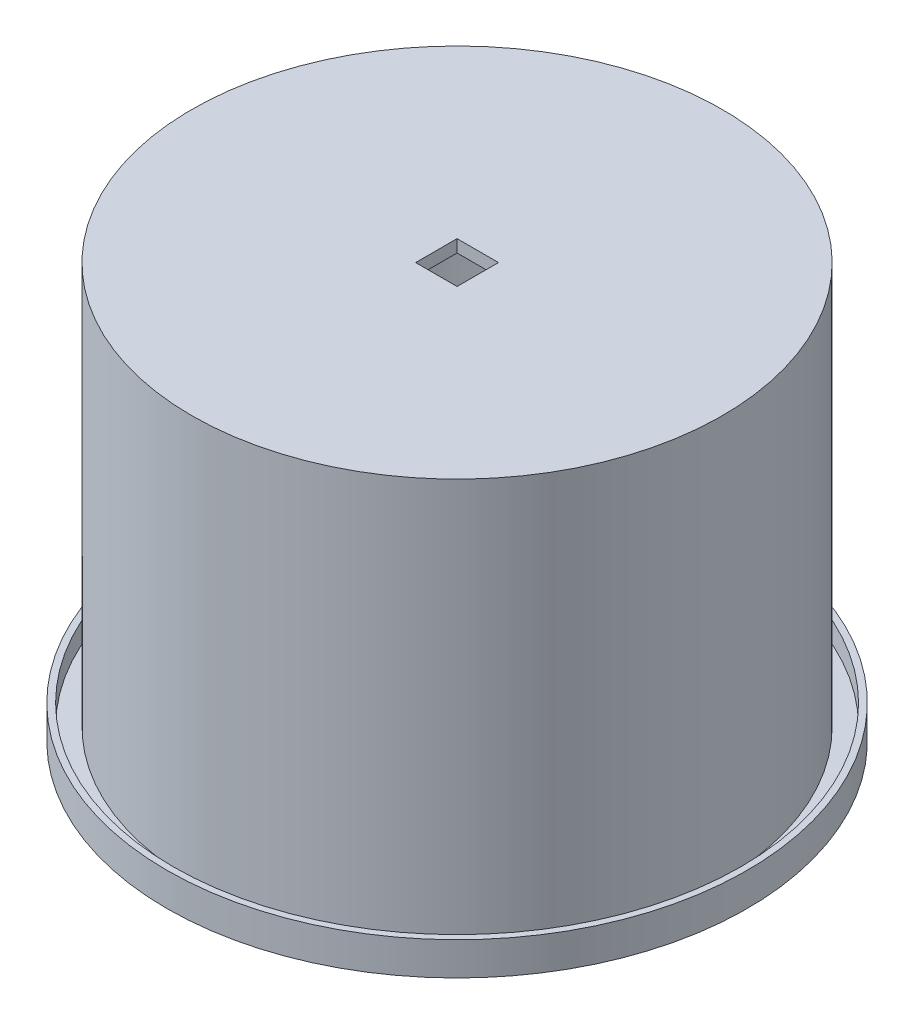
ISO-10303-21;
HEADER;
FILE_DESCRIPTION(('STEP AP214'),'2;1');
FILE_NAME('part.step','',(''),(''),'','','');
FILE_SCHEMA(('AUTOMOTIVE_DESIGN { 1 0 10303 214 1 1 1 1 }'));
ENDSEC;
DATA;
#1=APPLICATION_CONTEXT('core data for automotive mechanical design processes');
#2=APPLICATION_PROTOCOL_DEFINITION('international standard','automotive_design',2000,#1);
#3=PRODUCT_CONTEXT('',#1,'mechanical');
#4=PRODUCT('Part','Part','',(#3));
#5=PRODUCT_RELATED_PRODUCT_CATEGORY('part','',(#4));
#6=PRODUCT_DEFINITION_FORMATION('','',#4);
#7=PRODUCT_DEFINITION_CONTEXT('part definition',#1,'design');
#8=PRODUCT_DEFINITION('design','',#6,#7);
#9=PRODUCT_DEFINITION_SHAPE('','',#8);
#10=(LENGTH_UNIT() NAMED_UNIT(*) SI_UNIT(.MILLI.,.METRE.));
#11=(NAMED_UNIT(*) PLANE_ANGLE_UNIT() SI_UNIT($,.RADIAN.));
#12=(NAMED_UNIT(*) SI_UNIT($,.STERADIAN.) SOLID_ANGLE_UNIT());
#13=UNCERTAINTY_MEASURE_WITH_UNIT(LENGTH_MEASURE(1.E-05),#10,'distance_accuracy_value','');
#14=(GEOMETRIC_REPRESENTATION_CONTEXT(3) GLOBAL_UNCERTAINTY_ASSIGNED_CONTEXT((#13)) GLOBAL_UNIT_ASSIGNED_CONTEXT((#10,
#11,#12)) REPRESENTATION_CONTEXT('',''));
#15=CARTESIAN_POINT('',(0.,0.,0.));
#16=DIRECTION('',(0.,0.,1.));
#17=DIRECTION('',(1.,0.,0.));
#18=AXIS2_PLACEMENT_3D('',#15,#16,#17);
#19=CARTESIAN_POINT('',(0.,100.,0.));
#20=DIRECTION('',(0.,-1.,0.));
#21=DIRECTION('',(0.,0.,-1.));
#22=AXIS2_PLACEMENT_3D('',#19,#20,#21);
#23=CYLINDRICAL_SURFACE('',#22,62.5);
#24=CARTESIAN_POINT('',(0.,0.,0.));
#25=DIRECTION('',(0.,1.,0.));
#26=DIRECTION('',(0.,0.,1.));
#27=AXIS2_PLACEMENT_3D('',#24,#25,#26);
#28=CIRCLE('',#27,62.5);
#29=CARTESIAN_POINT('',(0.,0.,62.5));
#30=VERTEX_POINT('',#29);
#31=EDGE_CURVE('E104',#30,#30,#28,.T.);
#32=ORIENTED_EDGE('',*,*,#31,.F.);
#33=EDGE_LOOP('',(#32));
#34=FACE_BOUND('',#33,.T.);
#35=CARTESIAN_POINT('',(0.,97.,0.));
#36=DIRECTION('',(0.,1.,0.));
#37=DIRECTION('',(0.,0.,1.));
#38=AXIS2_PLACEMENT_3D('',#35,#36,#37);
#39=CIRCLE('',#38,62.5);
#40=CARTESIAN_POINT('',(0.,97.,62.5));
#41=VERTEX_POINT('',#40);
#42=EDGE_CURVE('E99',#41,#41,#39,.T.);
#43=ORIENTED_EDGE('',*,*,#42,.T.);
#44=EDGE_LOOP('',(#43));
#45=FACE_BOUND('',#44,.T.);
#46=ADVANCED_FACE('F32',(#34,#45),#23,.F.);
#47=CARTESIAN_POINT('',(0.,8.,0.));
#48=DIRECTION('',(0.,1.,0.));
#49=DIRECTION('',(0.,0.,1.));
#50=AXIS2_PLACEMENT_3D('',#47,#48,#49);
#51=PLANE('',#50);
#52=CARTESIAN_POINT('',(0.,8.,0.));
#53=DIRECTION('',(0.,1.,0.));
#54=DIRECTION('',(0.,0.,1.));
#55=AXIS2_PLACEMENT_3D('',#52,#53,#54);
#56=CIRCLE('',#55,70.);
#57=CARTESIAN_POINT('',(0.,8.,70.));
#58=VERTEX_POINT('',#57);
#59=EDGE_CURVE('E117',#58,#58,#56,.T.);
#60=ORIENTED_EDGE('',*,*,#59,.T.);
#61=EDGE_LOOP('',(#60));
#62=FACE_BOUND('',#61,.T.);
#63=CARTESIAN_POINT('',(0.,8.,0.));
#64=DIRECTION('',(0.,1.,0.));
#65=DIRECTION('',(0.,0.,1.));
#66=AXIS2_PLACEMENT_3D('',#63,#64,#65);
#67=CIRCLE('',#66,68.5);
#68=CARTESIAN_POINT('',(0.,8.,68.5));
#69=VERTEX_POINT('',#68);
#70=EDGE_CURVE('E113',#69,#69,#67,.T.);
#71=ORIENTED_EDGE('',*,*,#70,.F.);
#72=EDGE_LOOP('',(#71));
#73=FACE_BOUND('',#72,.T.);
#74=ADVANCED_FACE('F146',(#62,#73),#51,.T.);
#75=CARTESIAN_POINT('',(0.,0.,0.));
#76=DIRECTION('',(0.,1.,0.));
#77=DIRECTION('',(0.,0.,1.));
#78=AXIS2_PLACEMENT_3D('',#75,#76,#77);
#79=PLANE('',#78);
#80=CARTESIAN_POINT('',(0.,0.,0.));
#81=DIRECTION('',(0.,1.,0.));
#82=DIRECTION('',(0.,0.,1.));
#83=AXIS2_PLACEMENT_3D('',#80,#81,#82);
#84=CIRCLE('',#83,70.);
#85=CARTESIAN_POINT('',(0.,0.,70.));
#86=VERTEX_POINT('',#85);
#87=EDGE_CURVE('E116',#86,#86,#84,.T.);
#88=ORIENTED_EDGE('',*,*,#87,.F.);
#89=EDGE_LOOP('',(#88));
#90=FACE_BOUND('',#89,.T.);
#91=ORIENTED_EDGE('',*,*,#31,.T.);
#92=EDGE_LOOP('',(#91));
#93=FACE_BOUND('',#92,.T.);
#94=ADVANCED_FACE('F152',(#90,#93),#79,.F.);
#95=CARTESIAN_POINT('',(0.,8.,0.));
#96=DIRECTION('',(0.,-1.,0.));
#97=DIRECTION('',(0.,0.,-1.));
#98=AXIS2_PLACEMENT_3D('',#95,#96,#97);
#99=CYLINDRICAL_SURFACE('',#98,70.);
#100=ORIENTED_EDGE('',*,*,#59,.F.);
#101=EDGE_LOOP('',(#100));
#102=FACE_BOUND('',#101,.T.);
#103=ORIENTED_EDGE('',*,*,#87,.T.);
#104=EDGE_LOOP('',(#103));
#105=FACE_BOUND('',#104,.T.);
#106=ADVANCED_FACE('F34',(#102,#105),#99,.T.);
#107=CARTESIAN_POINT('',(0.,8.,0.));
#108=DIRECTION('',(0.,-1.,0.));
#109=DIRECTION('',(0.,0.,-1.));
#110=AXIS2_PLACEMENT_3D('',#107,#108,#109);
#111=CYLINDRICAL_SURFACE('',#110,68.5);
#112=CARTESIAN_POINT('',(0.,3.,0.));
#113=DIRECTION('',(0.,1.,0.));
#114=DIRECTION('',(0.,0.,1.));
#115=AXIS2_PLACEMENT_3D('',#112,#113,#114);
#116=CIRCLE('',#115,68.5);
#117=CARTESIAN_POINT('',(0.,3.,68.5));
#118=VERTEX_POINT('',#117);
#119=EDGE_CURVE('E120',#118,#118,#116,.T.);
#120=ORIENTED_EDGE('',*,*,#119,.F.);
#121=EDGE_LOOP('',(#120));
#122=FACE_BOUND('',#121,.T.);
#123=ORIENTED_EDGE('',*,*,#70,.T.);
#124=EDGE_LOOP('',(#123));
#125=FACE_BOUND('',#124,.T.);
#126=ADVANCED_FACE('F166',(#122,#125),#111,.F.);
#127=CARTESIAN_POINT('',(0.,3.,0.));
#128=DIRECTION('',(0.,1.,0.));
#129=DIRECTION('',(0.,0.,1.));
#130=AXIS2_PLACEMENT_3D('',#127,#128,#129);
#131=PLANE('',#130);
#132=ORIENTED_EDGE('',*,*,#119,.T.);
#133=EDGE_LOOP('',(#132));
#134=FACE_BOUND('',#133,.T.);
#135=CARTESIAN_POINT('',(0.,3.,0.));
#136=DIRECTION('',(0.,1.,0.));
#137=DIRECTION('',(0.,0.,1.));
#138=AXIS2_PLACEMENT_3D('',#135,#136,#137);
#139=CIRCLE('',#138,64.);
#140=CARTESIAN_POINT('',(0.,3.,64.));
#141=VERTEX_POINT('',#140);
#142=EDGE_CURVE('E110',#141,#141,#139,.T.);
#143=ORIENTED_EDGE('',*,*,#142,.F.);
#144=EDGE_LOOP('',(#143));
#145=FACE_BOUND('',#144,.T.);
#146=ADVANCED_FACE('F160',(#134,#145),#131,.T.);
#147=CARTESIAN_POINT('',(0.,100.,0.));
#148=DIRECTION('',(0.,1.,0.));
#149=DIRECTION('',(0.,0.,1.));
#150=AXIS2_PLACEMENT_3D('',#147,#148,#149);
#151=PLANE('',#150);
#152=DIRECTION('',(0.,0.,-1.));
#153=VECTOR('',#152,1.);
#154=CARTESIAN_POINT('',(5.,100.,5.));
#155=LINE('',#154,#153);
#156=CARTESIAN_POINT('',(5.,100.,5.));
#157=VERTEX_POINT('',#156);
#158=CARTESIAN_POINT('',(5.,100.,-5.));
#159=VERTEX_POINT('',#158);
#160=EDGE_CURVE('E47',#157,#159,#155,.T.);
#161=ORIENTED_EDGE('',*,*,#160,.F.);
#162=DIRECTION('',(1.,0.,0.));
#163=VECTOR('',#162,1.);
#164=CARTESIAN_POINT('',(-5.,100.,5.));
#165=LINE('',#164,#163);
#166=CARTESIAN_POINT('',(-5.,100.,5.));
#167=VERTEX_POINT('',#166);
#168=EDGE_CURVE('E92',#167,#157,#165,.T.);
#169=ORIENTED_EDGE('',*,*,#168,.F.);
#170=DIRECTION('',(0.,0.,1.));
#171=VECTOR('',#170,1.);
#172=CARTESIAN_POINT('',(-5.,100.,5.));
#173=LINE('',#172,#171);
#174=CARTESIAN_POINT('',(-5.,100.,-5.));
#175=VERTEX_POINT('',#174);
#176=EDGE_CURVE('E76',#175,#167,#173,.T.);
#177=ORIENTED_EDGE('',*,*,#176,.F.);
#178=DIRECTION('',(-1.,0.,0.));
#179=VECTOR('',#178,1.);
#180=CARTESIAN_POINT('',(-5.,100.,-5.));
#181=LINE('',#180,#179);
#182=EDGE_CURVE('E85',#159,#175,#181,.T.);
#183=ORIENTED_EDGE('',*,*,#182,.F.);
#184=EDGE_LOOP('',(#161,#169,#177,#183));
#185=FACE_BOUND('',#184,.T.);
#186=CARTESIAN_POINT('',(0.,100.,0.));
#187=DIRECTION('',(0.,1.,0.));
#188=DIRECTION('',(0.,0.,1.));
#189=AXIS2_PLACEMENT_3D('',#186,#187,#188);
#190=CIRCLE('',#189,64.);
#191=CARTESIAN_POINT('',(0.,100.,64.));
#192=VERTEX_POINT('',#191);
#193=EDGE_CURVE('E107',#192,#192,#190,.T.);
#194=ORIENTED_EDGE('',*,*,#193,.T.);
#195=EDGE_LOOP('',(#194));
#196=FACE_BOUND('',#195,.T.);
#197=ADVANCED_FACE('F89',(#185,#196),#151,.T.);
#198=CARTESIAN_POINT('',(0.,100.,0.));
#199=DIRECTION('',(0.,-1.,0.));
#200=DIRECTION('',(0.,0.,-1.));
#201=AXIS2_PLACEMENT_3D('',#198,#199,#200);
#202=CYLINDRICAL_SURFACE('',#201,64.);
#203=ORIENTED_EDGE('',*,*,#142,.T.);
#204=EDGE_LOOP('',(#203));
#205=FACE_BOUND('',#204,.T.);
#206=ORIENTED_EDGE('',*,*,#193,.F.);
#207=EDGE_LOOP('',(#206));
#208=FACE_BOUND('',#207,.T.);
#209=ADVANCED_FACE('F142',(#205,#208),#202,.T.);
#210=CARTESIAN_POINT('',(0.,97.,0.));
#211=DIRECTION('',(0.,1.,0.));
#212=DIRECTION('',(0.,0.,1.));
#213=AXIS2_PLACEMENT_3D('',#210,#211,#212);
#214=PLANE('',#213);
#215=DIRECTION('',(1.,0.,0.));
#216=VECTOR('',#215,1.);
#217=CARTESIAN_POINT('',(0.,97.,5.));
#218=LINE('',#217,#216);
#219=CARTESIAN_POINT('',(-5.,97.,5.));
#220=VERTEX_POINT('',#219);
#221=CARTESIAN_POINT('',(5.,97.,5.));
#222=VERTEX_POINT('',#221);
#223=EDGE_CURVE('E40',#220,#222,#218,.T.);
#224=ORIENTED_EDGE('',*,*,#223,.T.);
#225=DIRECTION('',(0.,0.,-1.));
#226=VECTOR('',#225,1.);
#227=CARTESIAN_POINT('',(5.,97.,0.));
#228=LINE('',#227,#226);
#229=CARTESIAN_POINT('',(5.,97.,-5.));
#230=VERTEX_POINT('',#229);
#231=EDGE_CURVE('E11',#222,#230,#228,.T.);
#232=ORIENTED_EDGE('',*,*,#231,.T.);
#233=DIRECTION('',(-1.,0.,0.));
#234=VECTOR('',#233,1.);
#235=CARTESIAN_POINT('',(0.,97.,-5.));
#236=LINE('',#235,#234);
#237=CARTESIAN_POINT('',(-5.,97.,-5.));
#238=VERTEX_POINT('',#237);
#239=EDGE_CURVE('E125',#230,#238,#236,.T.);
#240=ORIENTED_EDGE('',*,*,#239,.T.);
#241=DIRECTION('',(0.,0.,1.));
#242=VECTOR('',#241,1.);
#243=CARTESIAN_POINT('',(-5.,97.,0.));
#244=LINE('',#243,#242);
#245=EDGE_CURVE('E79',#238,#220,#244,.T.);
#246=ORIENTED_EDGE('',*,*,#245,.T.);
#247=EDGE_LOOP('',(#224,#232,#240,#246));
#248=FACE_BOUND('',#247,.T.);
#249=ORIENTED_EDGE('',*,*,#42,.F.);
#250=EDGE_LOOP('',(#249));
#251=FACE_BOUND('',#250,.T.);
#252=ADVANCED_FACE('F129',(#248,#251),#214,.F.);
#253=CARTESIAN_POINT('',(5.,90.,5.));
#254=DIRECTION('',(1.,0.,0.));
#255=DIRECTION('',(0.,0.,-1.));
#256=AXIS2_PLACEMENT_3D('',#253,#254,#255);
#257=PLANE('',#256);
#258=DIRECTION('',(0.,1.,0.));
#259=VECTOR('',#258,1.);
#260=CARTESIAN_POINT('',(5.,90.,5.));
#261=LINE('',#260,#259);
#262=EDGE_CURVE('E97',#222,#157,#261,.T.);
#263=ORIENTED_EDGE('',*,*,#262,.T.);
#264=ORIENTED_EDGE('',*,*,#160,.T.);
#265=DIRECTION('',(0.,1.,0.));
#266=VECTOR('',#265,1.);
#267=CARTESIAN_POINT('',(5.,90.,-5.));
#268=LINE('',#267,#266);
#269=EDGE_CURVE('E82',#230,#159,#268,.T.);
#270=ORIENTED_EDGE('',*,*,#269,.F.);
#271=ORIENTED_EDGE('',*,*,#231,.F.);
#272=EDGE_LOOP('',(#263,#264,#270,#271));
#273=FACE_BOUND('',#272,.T.);
#274=ADVANCED_FACE('F134',(#273),#257,.F.);
#275=CARTESIAN_POINT('',(-5.,90.,5.));
#276=DIRECTION('',(0.,0.,1.));
#277=DIRECTION('',(1.,0.,0.));
#278=AXIS2_PLACEMENT_3D('',#275,#276,#277);
#279=PLANE('',#278);
#280=DIRECTION('',(0.,1.,0.));
#281=VECTOR('',#280,1.);
#282=CARTESIAN_POINT('',(-5.,90.,5.));
#283=LINE('',#282,#281);
#284=EDGE_CURVE('E81',#220,#167,#283,.T.);
#285=ORIENTED_EDGE('',*,*,#284,.T.);
#286=ORIENTED_EDGE('',*,*,#168,.T.);
#287=ORIENTED_EDGE('',*,*,#262,.F.);
#288=ORIENTED_EDGE('',*,*,#223,.F.);
#289=EDGE_LOOP('',(#285,#286,#287,#288));
#290=FACE_BOUND('',#289,.T.);
#291=ADVANCED_FACE('F133',(#290),#279,.F.);
#292=CARTESIAN_POINT('',(-5.,90.,5.));
#293=DIRECTION('',(-1.,0.,0.));
#294=DIRECTION('',(0.,0.,1.));
#295=AXIS2_PLACEMENT_3D('',#292,#293,#294);
#296=PLANE('',#295);
#297=DIRECTION('',(0.,1.,0.));
#298=VECTOR('',#297,1.);
#299=CARTESIAN_POINT('',(-5.,90.,-5.));
#300=LINE('',#299,#298);
#301=EDGE_CURVE('E55',#238,#175,#300,.T.);
#302=ORIENTED_EDGE('',*,*,#301,.T.);
#303=ORIENTED_EDGE('',*,*,#176,.T.);
#304=ORIENTED_EDGE('',*,*,#284,.F.);
#305=ORIENTED_EDGE('',*,*,#245,.F.);
#306=EDGE_LOOP('',(#302,#303,#304,#305));
#307=FACE_BOUND('',#306,.T.);
#308=ADVANCED_FACE('F73',(#307),#296,.F.);
#309=CARTESIAN_POINT('',(-5.,90.,-5.));
#310=DIRECTION('',(0.,0.,-1.));
#311=DIRECTION('',(-1.,0.,0.));
#312=AXIS2_PLACEMENT_3D('',#309,#310,#311);
#313=PLANE('',#312);
#314=ORIENTED_EDGE('',*,*,#269,.T.);
#315=ORIENTED_EDGE('',*,*,#182,.T.);
#316=ORIENTED_EDGE('',*,*,#301,.F.);
#317=ORIENTED_EDGE('',*,*,#239,.F.);
#318=EDGE_LOOP('',(#314,#315,#316,#317));
#319=FACE_BOUND('',#318,.T.);
#320=ADVANCED_FACE('F86',(#319),#313,.F.);
#321=CLOSED_SHELL('',(#46,#74,#94,#106,#126,#146,#197,#209,#252,#274,#291,#308,#320));
#322=MANIFOLD_SOLID_BREP('B2',#321);
#323=ADVANCED_BREP_SHAPE_REPRESENTATION('',(#18,#322),#14);
#324=SHAPE_DEFINITION_REPRESENTATION(#9,#323);
ENDSEC;
END-ISO-10303-21;
